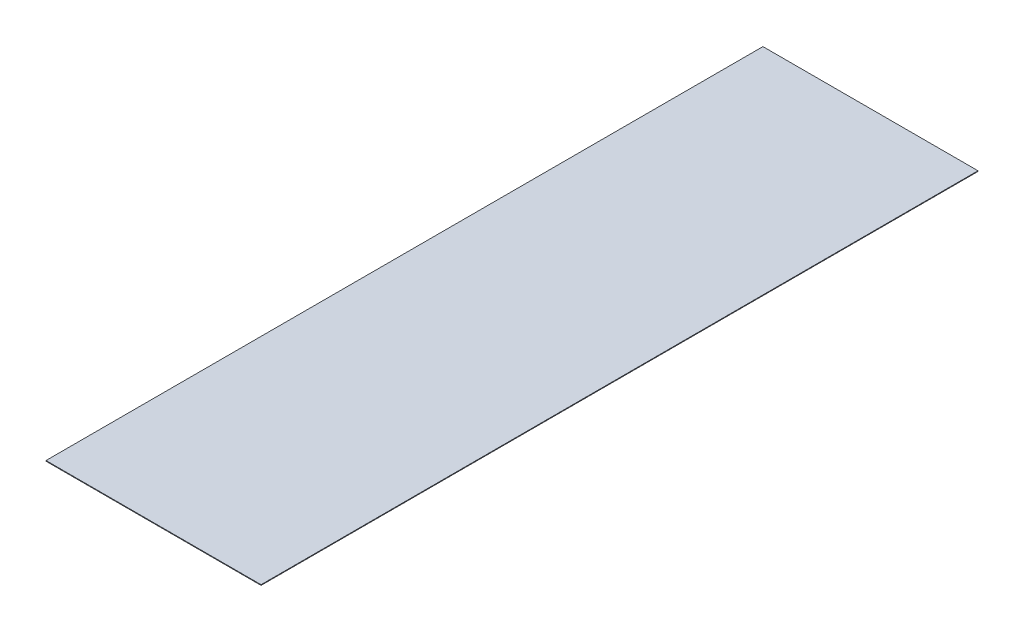
ISO-10303-21;
HEADER;
FILE_DESCRIPTION(('STEP AP214'),'2;1');
FILE_NAME('part.step','',(''),(''),'','','');
FILE_SCHEMA(('AUTOMOTIVE_DESIGN { 1 0 10303 214 1 1 1 1 }'));
ENDSEC;
DATA;
#1=APPLICATION_CONTEXT('core data for automotive mechanical design processes');
#2=APPLICATION_PROTOCOL_DEFINITION('international standard','automotive_design',2000,#1);
#3=PRODUCT_CONTEXT('',#1,'mechanical');
#4=PRODUCT('Part','Part','',(#3));
#5=PRODUCT_RELATED_PRODUCT_CATEGORY('part','',(#4));
#6=PRODUCT_DEFINITION_FORMATION('','',#4);
#7=PRODUCT_DEFINITION_CONTEXT('part definition',#1,'design');
#8=PRODUCT_DEFINITION('design','',#6,#7);
#9=PRODUCT_DEFINITION_SHAPE('','',#8);
#10=(LENGTH_UNIT() NAMED_UNIT(*) SI_UNIT(.MILLI.,.METRE.));
#11=(NAMED_UNIT(*) PLANE_ANGLE_UNIT() SI_UNIT($,.RADIAN.));
#12=(NAMED_UNIT(*) SI_UNIT($,.STERADIAN.) SOLID_ANGLE_UNIT());
#13=UNCERTAINTY_MEASURE_WITH_UNIT(LENGTH_MEASURE(1.E-05),#10,'distance_accuracy_value','');
#14=(GEOMETRIC_REPRESENTATION_CONTEXT(3) GLOBAL_UNCERTAINTY_ASSIGNED_CONTEXT((#13)) GLOBAL_UNIT_ASSIGNED_CONTEXT((#10,
#11,#12)) REPRESENTATION_CONTEXT('',''));
#15=CARTESIAN_POINT('',(0.,0.,0.));
#16=DIRECTION('',(0.,0.,1.));
#17=DIRECTION('',(1.,0.,0.));
#18=AXIS2_PLACEMENT_3D('',#15,#16,#17);
#19=CARTESIAN_POINT('',(457.2,2.7,1524.));
#20=DIRECTION('',(-1.,0.,0.));
#21=DIRECTION('',(0.,0.,1.));
#22=AXIS2_PLACEMENT_3D('',#19,#20,#21);
#23=PLANE('',#22);
#24=DIRECTION('',(0.,0.,-1.));
#25=VECTOR('',#24,1.);
#26=CARTESIAN_POINT('',(457.2,0.,1524.));
#27=LINE('',#26,#25);
#28=CARTESIAN_POINT('',(457.2,0.,1524.));
#29=VERTEX_POINT('',#28);
#30=CARTESIAN_POINT('',(457.2,0.,-1524.));
#31=VERTEX_POINT('',#30);
#32=EDGE_CURVE('E96',#29,#31,#27,.T.);
#33=ORIENTED_EDGE('',*,*,#32,.T.);
#34=DIRECTION('',(0.,-1.,0.));
#35=VECTOR('',#34,1.);
#36=CARTESIAN_POINT('',(457.2,2.7,-1524.));
#37=LINE('',#36,#35);
#38=CARTESIAN_POINT('',(457.2,2.7,-1524.));
#39=VERTEX_POINT('',#38);
#40=EDGE_CURVE('E11',#39,#31,#37,.T.);
#41=ORIENTED_EDGE('',*,*,#40,.F.);
#42=DIRECTION('',(0.,0.,-1.));
#43=VECTOR('',#42,1.);
#44=CARTESIAN_POINT('',(457.2,2.7,1524.));
#45=LINE('',#44,#43);
#46=CARTESIAN_POINT('',(457.2,2.7,1524.));
#47=VERTEX_POINT('',#46);
#48=EDGE_CURVE('E84',#47,#39,#45,.T.);
#49=ORIENTED_EDGE('',*,*,#48,.F.);
#50=DIRECTION('',(0.,-1.,0.));
#51=VECTOR('',#50,1.);
#52=CARTESIAN_POINT('',(457.2,2.7,1524.));
#53=LINE('',#52,#51);
#54=EDGE_CURVE('E92',#47,#29,#53,.T.);
#55=ORIENTED_EDGE('',*,*,#54,.T.);
#56=EDGE_LOOP('',(#33,#41,#49,#55));
#57=FACE_BOUND('',#56,.T.);
#58=ADVANCED_FACE('F33',(#57),#23,.F.);
#59=CARTESIAN_POINT('',(-457.2,2.7,-1524.));
#60=DIRECTION('',(0.,0.,1.));
#61=DIRECTION('',(1.,0.,0.));
#62=AXIS2_PLACEMENT_3D('',#59,#60,#61);
#63=PLANE('',#62);
#64=DIRECTION('',(-1.,0.,0.));
#65=VECTOR('',#64,1.);
#66=CARTESIAN_POINT('',(-457.2,0.,-1524.));
#67=LINE('',#66,#65);
#68=CARTESIAN_POINT('',(-457.2,0.,-1524.));
#69=VERTEX_POINT('',#68);
#70=EDGE_CURVE('E88',#31,#69,#67,.T.);
#71=ORIENTED_EDGE('',*,*,#70,.T.);
#72=DIRECTION('',(0.,-1.,0.));
#73=VECTOR('',#72,1.);
#74=CARTESIAN_POINT('',(-457.2,2.7,-1524.));
#75=LINE('',#74,#73);
#76=CARTESIAN_POINT('',(-457.2,2.7,-1524.));
#77=VERTEX_POINT('',#76);
#78=EDGE_CURVE('E41',#77,#69,#75,.T.);
#79=ORIENTED_EDGE('',*,*,#78,.F.);
#80=DIRECTION('',(-1.,0.,0.));
#81=VECTOR('',#80,1.);
#82=CARTESIAN_POINT('',(-457.2,2.7,-1524.));
#83=LINE('',#82,#81);
#84=EDGE_CURVE('E79',#39,#77,#83,.T.);
#85=ORIENTED_EDGE('',*,*,#84,.F.);
#86=ORIENTED_EDGE('',*,*,#40,.T.);
#87=EDGE_LOOP('',(#71,#79,#85,#86));
#88=FACE_BOUND('',#87,.T.);
#89=ADVANCED_FACE('F87',(#88),#63,.F.);
#90=CARTESIAN_POINT('',(-457.2,2.7,1524.));
#91=DIRECTION('',(1.,0.,0.));
#92=DIRECTION('',(0.,0.,-1.));
#93=AXIS2_PLACEMENT_3D('',#90,#91,#92);
#94=PLANE('',#93);
#95=DIRECTION('',(0.,0.,1.));
#96=VECTOR('',#95,1.);
#97=CARTESIAN_POINT('',(-457.2,0.,1524.));
#98=LINE('',#97,#96);
#99=CARTESIAN_POINT('',(-457.2,0.,1524.));
#100=VERTEX_POINT('',#99);
#101=EDGE_CURVE('E66',#69,#100,#98,.T.);
#102=ORIENTED_EDGE('',*,*,#101,.T.);
#103=DIRECTION('',(0.,-1.,0.));
#104=VECTOR('',#103,1.);
#105=CARTESIAN_POINT('',(-457.2,2.7,1524.));
#106=LINE('',#105,#104);
#107=CARTESIAN_POINT('',(-457.2,2.7,1524.));
#108=VERTEX_POINT('',#107);
#109=EDGE_CURVE('E89',#108,#100,#106,.T.);
#110=ORIENTED_EDGE('',*,*,#109,.F.);
#111=DIRECTION('',(0.,0.,1.));
#112=VECTOR('',#111,1.);
#113=CARTESIAN_POINT('',(-457.2,2.7,1524.));
#114=LINE('',#113,#112);
#115=EDGE_CURVE('E82',#77,#108,#114,.T.);
#116=ORIENTED_EDGE('',*,*,#115,.F.);
#117=ORIENTED_EDGE('',*,*,#78,.T.);
#118=EDGE_LOOP('',(#102,#110,#116,#117));
#119=FACE_BOUND('',#118,.T.);
#120=ADVANCED_FACE('F90',(#119),#94,.F.);
#121=CARTESIAN_POINT('',(-457.2,2.7,1524.));
#122=DIRECTION('',(0.,0.,-1.));
#123=DIRECTION('',(-1.,0.,0.));
#124=AXIS2_PLACEMENT_3D('',#121,#122,#123);
#125=PLANE('',#124);
#126=DIRECTION('',(1.,0.,0.));
#127=VECTOR('',#126,1.);
#128=CARTESIAN_POINT('',(-457.2,0.,1524.));
#129=LINE('',#128,#127);
#130=EDGE_CURVE('E72',#100,#29,#129,.T.);
#131=ORIENTED_EDGE('',*,*,#130,.T.);
#132=ORIENTED_EDGE('',*,*,#54,.F.);
#133=DIRECTION('',(1.,0.,0.));
#134=VECTOR('',#133,1.);
#135=CARTESIAN_POINT('',(-457.2,2.7,1524.));
#136=LINE('',#135,#134);
#137=EDGE_CURVE('E49',#108,#47,#136,.T.);
#138=ORIENTED_EDGE('',*,*,#137,.F.);
#139=ORIENTED_EDGE('',*,*,#109,.T.);
#140=EDGE_LOOP('',(#131,#132,#138,#139));
#141=FACE_BOUND('',#140,.T.);
#142=ADVANCED_FACE('F103',(#141),#125,.F.);
#143=CARTESIAN_POINT('',(0.,2.7,0.));
#144=DIRECTION('',(0.,-1.,0.));
#145=DIRECTION('',(0.,0.,-1.));
#146=AXIS2_PLACEMENT_3D('',#143,#144,#145);
#147=PLANE('',#146);
#148=ORIENTED_EDGE('',*,*,#48,.T.);
#149=ORIENTED_EDGE('',*,*,#84,.T.);
#150=ORIENTED_EDGE('',*,*,#115,.T.);
#151=ORIENTED_EDGE('',*,*,#137,.T.);
#152=EDGE_LOOP('',(#148,#149,#150,#151));
#153=FACE_BOUND('',#152,.T.);
#154=ADVANCED_FACE('F80',(#153),#147,.F.);
#155=CARTESIAN_POINT('',(0.,0.,0.));
#156=DIRECTION('',(0.,-1.,0.));
#157=DIRECTION('',(0.,0.,-1.));
#158=AXIS2_PLACEMENT_3D('',#155,#156,#157);
#159=PLANE('',#158);
#160=ORIENTED_EDGE('',*,*,#32,.F.);
#161=ORIENTED_EDGE('',*,*,#130,.F.);
#162=ORIENTED_EDGE('',*,*,#101,.F.);
#163=ORIENTED_EDGE('',*,*,#70,.F.);
#164=EDGE_LOOP('',(#160,#161,#162,#163));
#165=FACE_BOUND('',#164,.T.);
#166=ADVANCED_FACE('F106',(#165),#159,.T.);
#167=CLOSED_SHELL('',(#58,#89,#120,#142,#154,#166));
#168=MANIFOLD_SOLID_BREP('B2',#167);
#169=ADVANCED_BREP_SHAPE_REPRESENTATION('',(#18,#168),#14);
#170=SHAPE_DEFINITION_REPRESENTATION(#9,#169);
ENDSEC;
END-ISO-10303-21;
